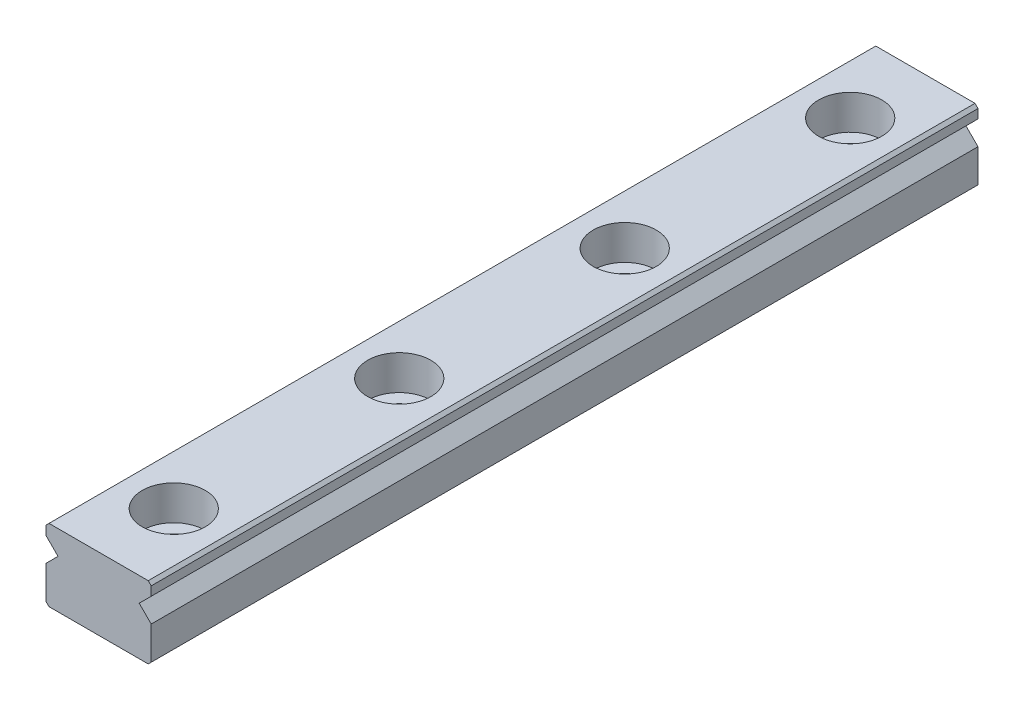
ISO-10303-21;
HEADER;
FILE_DESCRIPTION(('STEP AP214'),'2;1');
FILE_NAME('part.step','',(''),(''),'','','');
FILE_SCHEMA(('AUTOMOTIVE_DESIGN { 1 0 10303 214 1 1 1 1 }'));
ENDSEC;
DATA;
#1=APPLICATION_CONTEXT('core data for automotive mechanical design processes');
#2=APPLICATION_PROTOCOL_DEFINITION('international standard','automotive_design',2000,#1);
#3=PRODUCT_CONTEXT('',#1,'mechanical');
#4=PRODUCT('Part','Part','',(#3));
#5=PRODUCT_RELATED_PRODUCT_CATEGORY('part','',(#4));
#6=PRODUCT_DEFINITION_FORMATION('','',#4);
#7=PRODUCT_DEFINITION_CONTEXT('part definition',#1,'design');
#8=PRODUCT_DEFINITION('design','',#6,#7);
#9=PRODUCT_DEFINITION_SHAPE('','',#8);
#10=(LENGTH_UNIT() NAMED_UNIT(*) SI_UNIT(.MILLI.,.METRE.));
#11=(NAMED_UNIT(*) PLANE_ANGLE_UNIT() SI_UNIT($,.RADIAN.));
#12=(NAMED_UNIT(*) SI_UNIT($,.STERADIAN.) SOLID_ANGLE_UNIT());
#13=UNCERTAINTY_MEASURE_WITH_UNIT(LENGTH_MEASURE(1.E-05),#10,'distance_accuracy_value','');
#14=(GEOMETRIC_REPRESENTATION_CONTEXT(3) GLOBAL_UNCERTAINTY_ASSIGNED_CONTEXT((#13)) GLOBAL_UNIT_ASSIGNED_CONTEXT((#10,
#11,#12)) REPRESENTATION_CONTEXT('',''));
#15=CARTESIAN_POINT('',(0.,0.,0.));
#16=DIRECTION('',(0.,0.,1.));
#17=DIRECTION('',(1.,0.,0.));
#18=AXIS2_PLACEMENT_3D('',#15,#16,#17);
#19=CARTESIAN_POINT('',(-3.5,2.4,55.));
#20=DIRECTION('',(1.,0.,0.));
#21=DIRECTION('',(0.,0.,-1.));
#22=AXIS2_PLACEMENT_3D('',#19,#20,#21);
#23=PLANE('',#22);
#24=DIRECTION('',(0.,-1.,0.));
#25=VECTOR('',#24,1.);
#26=CARTESIAN_POINT('',(-3.5,2.4,0.));
#27=LINE('',#26,#25);
#28=CARTESIAN_POINT('',(-3.5,2.4,0.));
#29=VERTEX_POINT('',#28);
#30=CARTESIAN_POINT('',(-3.5,0.200000000000013,0.));
#31=VERTEX_POINT('',#30);
#32=EDGE_CURVE('E179',#29,#31,#27,.T.);
#33=ORIENTED_EDGE('',*,*,#32,.T.);
#34=DIRECTION('',(0.,0.,1.));
#35=VECTOR('',#34,1.);
#36=CARTESIAN_POINT('',(-3.5,0.200000000000013,55.));
#37=LINE('',#36,#35);
#38=CARTESIAN_POINT('',(-3.5,0.200000000000013,55.));
#39=VERTEX_POINT('',#38);
#40=EDGE_CURVE('E227',#31,#39,#37,.T.);
#41=ORIENTED_EDGE('',*,*,#40,.T.);
#42=DIRECTION('',(0.,-1.,0.));
#43=VECTOR('',#42,1.);
#44=CARTESIAN_POINT('',(-3.5,2.4,55.));
#45=LINE('',#44,#43);
#46=CARTESIAN_POINT('',(-3.5,2.4,55.));
#47=VERTEX_POINT('',#46);
#48=EDGE_CURVE('E202',#47,#39,#45,.T.);
#49=ORIENTED_EDGE('',*,*,#48,.F.);
#50=DIRECTION('',(0.,0.,-1.));
#51=VECTOR('',#50,1.);
#52=CARTESIAN_POINT('',(-3.5,2.4,55.));
#53=LINE('',#52,#51);
#54=EDGE_CURVE('E178',#47,#29,#53,.T.);
#55=ORIENTED_EDGE('',*,*,#54,.T.);
#56=EDGE_LOOP('',(#33,#41,#49,#55));
#57=FACE_BOUND('',#56,.T.);
#58=ADVANCED_FACE('F34',(#57),#23,.F.);
#59=CARTESIAN_POINT('',(-3.5,0.,55.));
#60=DIRECTION('',(0.,1.,0.));
#61=DIRECTION('',(-1.,0.,0.));
#62=AXIS2_PLACEMENT_3D('',#59,#60,#61);
#63=PLANE('',#62);
#64=CARTESIAN_POINT('',(0.,0.,20.));
#65=DIRECTION('',(0.,1.,0.));
#66=DIRECTION('',(-1.,0.,0.));
#67=AXIS2_PLACEMENT_3D('',#64,#65,#66);
#68=CIRCLE('',#67,1.2);
#69=CARTESIAN_POINT('',(-1.2,0.,20.));
#70=VERTEX_POINT('',#69);
#71=EDGE_CURVE('E309',#70,#70,#68,.T.);
#72=ORIENTED_EDGE('',*,*,#71,.T.);
#73=EDGE_LOOP('',(#72));
#74=FACE_BOUND('',#73,.T.);
#75=CARTESIAN_POINT('',(0.,0.,50.));
#76=DIRECTION('',(0.,1.,0.));
#77=DIRECTION('',(-1.,0.,0.));
#78=AXIS2_PLACEMENT_3D('',#75,#76,#77);
#79=CIRCLE('',#78,1.2);
#80=CARTESIAN_POINT('',(-1.2,0.,50.));
#81=VERTEX_POINT('',#80);
#82=EDGE_CURVE('E321',#81,#81,#79,.T.);
#83=ORIENTED_EDGE('',*,*,#82,.T.);
#84=EDGE_LOOP('',(#83));
#85=FACE_BOUND('',#84,.T.);
#86=CARTESIAN_POINT('',(0.,0.,35.));
#87=DIRECTION('',(0.,1.,0.));
#88=DIRECTION('',(-1.,0.,0.));
#89=AXIS2_PLACEMENT_3D('',#86,#87,#88);
#90=CIRCLE('',#89,1.2);
#91=CARTESIAN_POINT('',(-1.2,0.,35.));
#92=VERTEX_POINT('',#91);
#93=EDGE_CURVE('E315',#92,#92,#90,.T.);
#94=ORIENTED_EDGE('',*,*,#93,.T.);
#95=EDGE_LOOP('',(#94));
#96=FACE_BOUND('',#95,.T.);
#97=CARTESIAN_POINT('',(0.,0.,5.));
#98=DIRECTION('',(0.,1.,0.));
#99=DIRECTION('',(-1.,0.,0.));
#100=AXIS2_PLACEMENT_3D('',#97,#98,#99);
#101=CIRCLE('',#100,1.2);
#102=CARTESIAN_POINT('',(-1.2,0.,5.));
#103=VERTEX_POINT('',#102);
#104=EDGE_CURVE('E292',#103,#103,#101,.T.);
#105=ORIENTED_EDGE('',*,*,#104,.T.);
#106=EDGE_LOOP('',(#105));
#107=FACE_BOUND('',#106,.T.);
#108=DIRECTION('',(1.,0.,0.));
#109=VECTOR('',#108,1.);
#110=CARTESIAN_POINT('',(-3.5,0.,55.));
#111=LINE('',#110,#109);
#112=CARTESIAN_POINT('',(-3.29999999999999,0.,55.));
#113=VERTEX_POINT('',#112);
#114=CARTESIAN_POINT('',(3.3,0.,55.));
#115=VERTEX_POINT('',#114);
#116=EDGE_CURVE('E147',#113,#115,#111,.T.);
#117=ORIENTED_EDGE('',*,*,#116,.F.);
#118=DIRECTION('',(0.,0.,-1.));
#119=VECTOR('',#118,1.);
#120=CARTESIAN_POINT('',(-3.29999999999999,0.,55.));
#121=LINE('',#120,#119);
#122=CARTESIAN_POINT('',(-3.29999999999999,0.,0.));
#123=VERTEX_POINT('',#122);
#124=EDGE_CURVE('E216',#113,#123,#121,.T.);
#125=ORIENTED_EDGE('',*,*,#124,.T.);
#126=DIRECTION('',(1.,0.,0.));
#127=VECTOR('',#126,1.);
#128=CARTESIAN_POINT('',(-3.5,0.,0.));
#129=LINE('',#128,#127);
#130=CARTESIAN_POINT('',(3.3,0.,0.));
#131=VERTEX_POINT('',#130);
#132=EDGE_CURVE('E182',#123,#131,#129,.T.);
#133=ORIENTED_EDGE('',*,*,#132,.T.);
#134=DIRECTION('',(0.,0.,1.));
#135=VECTOR('',#134,1.);
#136=CARTESIAN_POINT('',(3.3,0.,55.));
#137=LINE('',#136,#135);
#138=EDGE_CURVE('E156',#131,#115,#137,.T.);
#139=ORIENTED_EDGE('',*,*,#138,.T.);
#140=EDGE_LOOP('',(#117,#125,#133,#139));
#141=FACE_BOUND('',#140,.T.);
#142=ADVANCED_FACE('F330',(#74,#85,#96,#107,#141),#63,.F.);
#143=CARTESIAN_POINT('',(3.5,0.,55.));
#144=DIRECTION('',(-1.,0.,0.));
#145=DIRECTION('',(0.,0.,1.));
#146=AXIS2_PLACEMENT_3D('',#143,#144,#145);
#147=PLANE('',#146);
#148=DIRECTION('',(0.,1.,0.));
#149=VECTOR('',#148,1.);
#150=CARTESIAN_POINT('',(3.5,0.,55.));
#151=LINE('',#150,#149);
#152=CARTESIAN_POINT('',(3.5,0.2,55.));
#153=VERTEX_POINT('',#152);
#154=CARTESIAN_POINT('',(3.5,2.4,55.));
#155=VERTEX_POINT('',#154);
#156=EDGE_CURVE('E134',#153,#155,#151,.T.);
#157=ORIENTED_EDGE('',*,*,#156,.F.);
#158=DIRECTION('',(0.,0.,-1.));
#159=VECTOR('',#158,1.);
#160=CARTESIAN_POINT('',(3.5,0.2,55.));
#161=LINE('',#160,#159);
#162=CARTESIAN_POINT('',(3.5,0.2,0.));
#163=VERTEX_POINT('',#162);
#164=EDGE_CURVE('E42',#153,#163,#161,.T.);
#165=ORIENTED_EDGE('',*,*,#164,.T.);
#166=DIRECTION('',(0.,1.,0.));
#167=VECTOR('',#166,1.);
#168=CARTESIAN_POINT('',(3.5,0.,0.));
#169=LINE('',#168,#167);
#170=CARTESIAN_POINT('',(3.5,2.4,0.));
#171=VERTEX_POINT('',#170);
#172=EDGE_CURVE('E153',#163,#171,#169,.T.);
#173=ORIENTED_EDGE('',*,*,#172,.T.);
#174=DIRECTION('',(0.,0.,-1.));
#175=VECTOR('',#174,1.);
#176=CARTESIAN_POINT('',(3.5,2.4,55.));
#177=LINE('',#176,#175);
#178=EDGE_CURVE('E150',#155,#171,#177,.T.);
#179=ORIENTED_EDGE('',*,*,#178,.F.);
#180=EDGE_LOOP('',(#157,#165,#173,#179));
#181=FACE_BOUND('',#180,.T.);
#182=ADVANCED_FACE('F151',(#181),#147,.F.);
#183=CARTESIAN_POINT('',(3.5,2.4,55.));
#184=DIRECTION('',(-0.707106781186547,-0.707106781186548,0.));
#185=DIRECTION('',(0.707106781186548,-0.707106781186547,0.));
#186=AXIS2_PLACEMENT_3D('',#183,#184,#185);
#187=PLANE('',#186);
#188=DIRECTION('',(-0.707106781186548,0.707106781186547,0.));
#189=VECTOR('',#188,1.);
#190=CARTESIAN_POINT('',(3.5,2.4,0.));
#191=LINE('',#190,#189);
#192=CARTESIAN_POINT('',(2.7,3.2,0.));
#193=VERTEX_POINT('',#192);
#194=EDGE_CURVE('E187',#171,#193,#191,.T.);
#195=ORIENTED_EDGE('',*,*,#194,.T.);
#196=DIRECTION('',(0.,0.,-1.));
#197=VECTOR('',#196,1.);
#198=CARTESIAN_POINT('',(2.7,3.2,55.));
#199=LINE('',#198,#197);
#200=CARTESIAN_POINT('',(2.7,3.2,55.));
#201=VERTEX_POINT('',#200);
#202=EDGE_CURVE('E157',#201,#193,#199,.T.);
#203=ORIENTED_EDGE('',*,*,#202,.F.);
#204=DIRECTION('',(-0.707106781186548,0.707106781186547,0.));
#205=VECTOR('',#204,1.);
#206=CARTESIAN_POINT('',(3.5,2.4,55.));
#207=LINE('',#206,#205);
#208=EDGE_CURVE('E139',#155,#201,#207,.T.);
#209=ORIENTED_EDGE('',*,*,#208,.F.);
#210=ORIENTED_EDGE('',*,*,#178,.T.);
#211=EDGE_LOOP('',(#195,#203,#209,#210));
#212=FACE_BOUND('',#211,.T.);
#213=ADVANCED_FACE('F159',(#212),#187,.F.);
#214=CARTESIAN_POINT('',(2.7,3.2,55.));
#215=DIRECTION('',(-0.707106781186547,0.707106781186548,0.));
#216=DIRECTION('',(-0.707106781186548,-0.707106781186547,0.));
#217=AXIS2_PLACEMENT_3D('',#214,#215,#216);
#218=PLANE('',#217);
#219=DIRECTION('',(0.707106781186548,0.707106781186547,0.));
#220=VECTOR('',#219,1.);
#221=CARTESIAN_POINT('',(2.7,3.2,0.));
#222=LINE('',#221,#220);
#223=CARTESIAN_POINT('',(3.5,4.,0.));
#224=VERTEX_POINT('',#223);
#225=EDGE_CURVE('E189',#193,#224,#222,.T.);
#226=ORIENTED_EDGE('',*,*,#225,.T.);
#227=DIRECTION('',(0.,0.,-1.));
#228=VECTOR('',#227,1.);
#229=CARTESIAN_POINT('',(3.5,4.,55.));
#230=LINE('',#229,#228);
#231=CARTESIAN_POINT('',(3.5,4.,55.));
#232=VERTEX_POINT('',#231);
#233=EDGE_CURVE('E211',#232,#224,#230,.T.);
#234=ORIENTED_EDGE('',*,*,#233,.F.);
#235=DIRECTION('',(0.707106781186548,0.707106781186547,0.));
#236=VECTOR('',#235,1.);
#237=CARTESIAN_POINT('',(2.7,3.2,55.));
#238=LINE('',#237,#236);
#239=EDGE_CURVE('E162',#201,#232,#238,.T.);
#240=ORIENTED_EDGE('',*,*,#239,.F.);
#241=ORIENTED_EDGE('',*,*,#202,.T.);
#242=EDGE_LOOP('',(#226,#234,#240,#241));
#243=FACE_BOUND('',#242,.T.);
#244=ADVANCED_FACE('F248',(#243),#218,.F.);
#245=CARTESIAN_POINT('',(3.5,4.,55.));
#246=DIRECTION('',(-1.,0.,0.));
#247=DIRECTION('',(0.,0.,1.));
#248=AXIS2_PLACEMENT_3D('',#245,#246,#247);
#249=PLANE('',#248);
#250=DIRECTION('',(0.,1.,0.));
#251=VECTOR('',#250,1.);
#252=CARTESIAN_POINT('',(3.5,4.,0.));
#253=LINE('',#252,#251);
#254=CARTESIAN_POINT('',(3.5,4.59999999999999,0.));
#255=VERTEX_POINT('',#254);
#256=EDGE_CURVE('E191',#224,#255,#253,.T.);
#257=ORIENTED_EDGE('',*,*,#256,.T.);
#258=DIRECTION('',(0.,0.,1.));
#259=VECTOR('',#258,1.);
#260=CARTESIAN_POINT('',(3.5,4.59999999999999,55.));
#261=LINE('',#260,#259);
#262=CARTESIAN_POINT('',(3.5,4.59999999999999,55.));
#263=VERTEX_POINT('',#262);
#264=EDGE_CURVE('E11',#255,#263,#261,.T.);
#265=ORIENTED_EDGE('',*,*,#264,.T.);
#266=DIRECTION('',(0.,1.,0.));
#267=VECTOR('',#266,1.);
#268=CARTESIAN_POINT('',(3.5,4.,55.));
#269=LINE('',#268,#267);
#270=EDGE_CURVE('E164',#232,#263,#269,.T.);
#271=ORIENTED_EDGE('',*,*,#270,.F.);
#272=ORIENTED_EDGE('',*,*,#233,.T.);
#273=EDGE_LOOP('',(#257,#265,#271,#272));
#274=FACE_BOUND('',#273,.T.);
#275=ADVANCED_FACE('F357',(#274),#249,.F.);
#276=CARTESIAN_POINT('',(3.5,4.8,55.));
#277=DIRECTION('',(0.,-1.,0.));
#278=DIRECTION('',(1.,0.,0.));
#279=AXIS2_PLACEMENT_3D('',#276,#277,#278);
#280=PLANE('',#279);
#281=CARTESIAN_POINT('',(0.,4.8,20.));
#282=DIRECTION('',(0.,1.,0.));
#283=DIRECTION('',(-1.,0.,0.));
#284=AXIS2_PLACEMENT_3D('',#281,#282,#283);
#285=CIRCLE('',#284,2.1);
#286=CARTESIAN_POINT('',(-2.1,4.8,20.));
#287=VERTEX_POINT('',#286);
#288=EDGE_CURVE('E301',#287,#287,#285,.T.);
#289=ORIENTED_EDGE('',*,*,#288,.F.);
#290=EDGE_LOOP('',(#289));
#291=FACE_BOUND('',#290,.T.);
#292=CARTESIAN_POINT('',(0.,4.8,35.));
#293=DIRECTION('',(0.,1.,0.));
#294=DIRECTION('',(-1.,0.,0.));
#295=AXIS2_PLACEMENT_3D('',#292,#293,#294);
#296=CIRCLE('',#295,2.1);
#297=CARTESIAN_POINT('',(-2.1,4.8,35.));
#298=VERTEX_POINT('',#297);
#299=EDGE_CURVE('E295',#298,#298,#296,.T.);
#300=ORIENTED_EDGE('',*,*,#299,.F.);
#301=EDGE_LOOP('',(#300));
#302=FACE_BOUND('',#301,.T.);
#303=CARTESIAN_POINT('',(0.,4.8,50.));
#304=DIRECTION('',(0.,1.,0.));
#305=DIRECTION('',(-1.,0.,0.));
#306=AXIS2_PLACEMENT_3D('',#303,#304,#305);
#307=CIRCLE('',#306,2.1);
#308=CARTESIAN_POINT('',(-2.1,4.8,50.));
#309=VERTEX_POINT('',#308);
#310=EDGE_CURVE('E288',#309,#309,#307,.T.);
#311=ORIENTED_EDGE('',*,*,#310,.F.);
#312=EDGE_LOOP('',(#311));
#313=FACE_BOUND('',#312,.T.);
#314=CARTESIAN_POINT('',(0.,4.8,5.));
#315=DIRECTION('',(0.,1.,0.));
#316=DIRECTION('',(-1.,0.,0.));
#317=AXIS2_PLACEMENT_3D('',#314,#315,#316);
#318=CIRCLE('',#317,2.1);
#319=CARTESIAN_POINT('',(-2.1,4.8,5.));
#320=VERTEX_POINT('',#319);
#321=EDGE_CURVE('E282',#320,#320,#318,.T.);
#322=ORIENTED_EDGE('',*,*,#321,.F.);
#323=EDGE_LOOP('',(#322));
#324=FACE_BOUND('',#323,.T.);
#325=DIRECTION('',(-1.,0.,0.));
#326=VECTOR('',#325,1.);
#327=CARTESIAN_POINT('',(3.5,4.8,0.));
#328=LINE('',#327,#326);
#329=CARTESIAN_POINT('',(3.29999999999999,4.8,0.));
#330=VERTEX_POINT('',#329);
#331=CARTESIAN_POINT('',(-3.29999999999999,4.8,0.));
#332=VERTEX_POINT('',#331);
#333=EDGE_CURVE('E194',#330,#332,#328,.T.);
#334=ORIENTED_EDGE('',*,*,#333,.T.);
#335=DIRECTION('',(0.,0.,1.));
#336=VECTOR('',#335,1.);
#337=CARTESIAN_POINT('',(-3.29999999999999,4.8,55.));
#338=LINE('',#337,#336);
#339=CARTESIAN_POINT('',(-3.29999999999999,4.8,55.));
#340=VERTEX_POINT('',#339);
#341=EDGE_CURVE('E57',#332,#340,#338,.T.);
#342=ORIENTED_EDGE('',*,*,#341,.T.);
#343=DIRECTION('',(-1.,0.,0.));
#344=VECTOR('',#343,1.);
#345=CARTESIAN_POINT('',(3.5,4.8,55.));
#346=LINE('',#345,#344);
#347=CARTESIAN_POINT('',(3.29999999999999,4.8,55.));
#348=VERTEX_POINT('',#347);
#349=EDGE_CURVE('E170',#348,#340,#346,.T.);
#350=ORIENTED_EDGE('',*,*,#349,.F.);
#351=DIRECTION('',(0.,0.,-1.));
#352=VECTOR('',#351,1.);
#353=CARTESIAN_POINT('',(3.29999999999999,4.8,55.));
#354=LINE('',#353,#352);
#355=EDGE_CURVE('E238',#348,#330,#354,.T.);
#356=ORIENTED_EDGE('',*,*,#355,.T.);
#357=EDGE_LOOP('',(#334,#342,#350,#356));
#358=FACE_BOUND('',#357,.T.);
#359=ADVANCED_FACE('F257',(#291,#302,#313,#324,#358),#280,.F.);
#360=CARTESIAN_POINT('',(-3.5,4.8,55.));
#361=DIRECTION('',(1.,0.,0.));
#362=DIRECTION('',(0.,0.,-1.));
#363=AXIS2_PLACEMENT_3D('',#360,#361,#362);
#364=PLANE('',#363);
#365=DIRECTION('',(0.,-1.,0.));
#366=VECTOR('',#365,1.);
#367=CARTESIAN_POINT('',(-3.5,4.8,55.));
#368=LINE('',#367,#366);
#369=CARTESIAN_POINT('',(-3.5,4.59999999999999,55.));
#370=VERTEX_POINT('',#369);
#371=CARTESIAN_POINT('',(-3.5,4.,55.));
#372=VERTEX_POINT('',#371);
#373=EDGE_CURVE('E172',#370,#372,#368,.T.);
#374=ORIENTED_EDGE('',*,*,#373,.F.);
#375=DIRECTION('',(0.,0.,-1.));
#376=VECTOR('',#375,1.);
#377=CARTESIAN_POINT('',(-3.5,4.59999999999999,55.));
#378=LINE('',#377,#376);
#379=CARTESIAN_POINT('',(-3.5,4.59999999999999,0.));
#380=VERTEX_POINT('',#379);
#381=EDGE_CURVE('E235',#370,#380,#378,.T.);
#382=ORIENTED_EDGE('',*,*,#381,.T.);
#383=DIRECTION('',(0.,-1.,0.));
#384=VECTOR('',#383,1.);
#385=CARTESIAN_POINT('',(-3.5,4.8,0.));
#386=LINE('',#385,#384);
#387=CARTESIAN_POINT('',(-3.5,4.,0.));
#388=VERTEX_POINT('',#387);
#389=EDGE_CURVE('E196',#380,#388,#386,.T.);
#390=ORIENTED_EDGE('',*,*,#389,.T.);
#391=DIRECTION('',(0.,0.,-1.));
#392=VECTOR('',#391,1.);
#393=CARTESIAN_POINT('',(-3.5,4.,55.));
#394=LINE('',#393,#392);
#395=EDGE_CURVE('E208',#372,#388,#394,.T.);
#396=ORIENTED_EDGE('',*,*,#395,.F.);
#397=EDGE_LOOP('',(#374,#382,#390,#396));
#398=FACE_BOUND('',#397,.T.);
#399=ADVANCED_FACE('F264',(#398),#364,.F.);
#400=CARTESIAN_POINT('',(-3.5,4.,55.));
#401=DIRECTION('',(0.707106781186547,0.707106781186548,0.));
#402=DIRECTION('',(-0.707106781186548,0.707106781186547,0.));
#403=AXIS2_PLACEMENT_3D('',#400,#401,#402);
#404=PLANE('',#403);
#405=DIRECTION('',(0.707106781186548,-0.707106781186547,0.));
#406=VECTOR('',#405,1.);
#407=CARTESIAN_POINT('',(-3.5,4.,0.));
#408=LINE('',#407,#406);
#409=CARTESIAN_POINT('',(-2.7,3.2,0.));
#410=VERTEX_POINT('',#409);
#411=EDGE_CURVE('E198',#388,#410,#408,.T.);
#412=ORIENTED_EDGE('',*,*,#411,.T.);
#413=DIRECTION('',(0.,0.,-1.));
#414=VECTOR('',#413,1.);
#415=CARTESIAN_POINT('',(-2.7,3.2,55.));
#416=LINE('',#415,#414);
#417=CARTESIAN_POINT('',(-2.7,3.2,55.));
#418=VERTEX_POINT('',#417);
#419=EDGE_CURVE('E205',#418,#410,#416,.T.);
#420=ORIENTED_EDGE('',*,*,#419,.F.);
#421=DIRECTION('',(0.707106781186548,-0.707106781186547,0.));
#422=VECTOR('',#421,1.);
#423=CARTESIAN_POINT('',(-3.5,4.,55.));
#424=LINE('',#423,#422);
#425=EDGE_CURVE('E174',#372,#418,#424,.T.);
#426=ORIENTED_EDGE('',*,*,#425,.F.);
#427=ORIENTED_EDGE('',*,*,#395,.T.);
#428=EDGE_LOOP('',(#412,#420,#426,#427));
#429=FACE_BOUND('',#428,.T.);
#430=ADVANCED_FACE('F271',(#429),#404,.F.);
#431=CARTESIAN_POINT('',(-2.7,3.2,55.));
#432=DIRECTION('',(0.707106781186548,-0.707106781186547,0.));
#433=DIRECTION('',(0.707106781186547,0.707106781186548,0.));
#434=AXIS2_PLACEMENT_3D('',#431,#432,#433);
#435=PLANE('',#434);
#436=DIRECTION('',(-0.707106781186547,-0.707106781186548,0.));
#437=VECTOR('',#436,1.);
#438=CARTESIAN_POINT('',(-2.7,3.2,0.));
#439=LINE('',#438,#437);
#440=EDGE_CURVE('E200',#410,#29,#439,.T.);
#441=ORIENTED_EDGE('',*,*,#440,.T.);
#442=ORIENTED_EDGE('',*,*,#54,.F.);
#443=DIRECTION('',(-0.707106781186547,-0.707106781186548,0.));
#444=VECTOR('',#443,1.);
#445=CARTESIAN_POINT('',(-2.7,3.2,55.));
#446=LINE('',#445,#444);
#447=EDGE_CURVE('E176',#418,#47,#446,.T.);
#448=ORIENTED_EDGE('',*,*,#447,.F.);
#449=ORIENTED_EDGE('',*,*,#419,.T.);
#450=EDGE_LOOP('',(#441,#442,#448,#449));
#451=FACE_BOUND('',#450,.T.);
#452=ADVANCED_FACE('F274',(#451),#435,.F.);
#453=CARTESIAN_POINT('',(0.,0.,55.));
#454=DIRECTION('',(0.,0.,1.));
#455=DIRECTION('',(1.,0.,0.));
#456=AXIS2_PLACEMENT_3D('',#453,#454,#455);
#457=PLANE('',#456);
#458=ORIENTED_EDGE('',*,*,#48,.T.);
#459=DIRECTION('',(-0.707106781186535,0.70710678118656,0.));
#460=VECTOR('',#459,1.);
#461=CARTESIAN_POINT('',(-1.65000000000005,-1.65,55.));
#462=LINE('',#461,#460);
#463=EDGE_CURVE('E233',#39,#113,#462,.F.);
#464=ORIENTED_EDGE('',*,*,#463,.T.);
#465=ORIENTED_EDGE('',*,*,#116,.T.);
#466=DIRECTION('',(-0.707106781186548,-0.707106781186548,0.));
#467=VECTOR('',#466,1.);
#468=CARTESIAN_POINT('',(1.65,-1.65,55.));
#469=LINE('',#468,#467);
#470=EDGE_CURVE('E143',#115,#153,#469,.F.);
#471=ORIENTED_EDGE('',*,*,#470,.T.);
#472=ORIENTED_EDGE('',*,*,#156,.T.);
#473=ORIENTED_EDGE('',*,*,#208,.T.);
#474=ORIENTED_EDGE('',*,*,#239,.T.);
#475=ORIENTED_EDGE('',*,*,#270,.T.);
#476=DIRECTION('',(0.707106781186535,-0.70710678118656,0.));
#477=VECTOR('',#476,1.);
#478=CARTESIAN_POINT('',(4.05000000000005,4.04999999999991,55.));
#479=LINE('',#478,#477);
#480=EDGE_CURVE('E229',#263,#348,#479,.F.);
#481=ORIENTED_EDGE('',*,*,#480,.T.);
#482=ORIENTED_EDGE('',*,*,#349,.T.);
#483=DIRECTION('',(0.707106781186548,0.707106781186548,0.));
#484=VECTOR('',#483,1.);
#485=CARTESIAN_POINT('',(-4.04999999999999,4.04999999999999,55.));
#486=LINE('',#485,#484);
#487=EDGE_CURVE('E49',#340,#370,#486,.F.);
#488=ORIENTED_EDGE('',*,*,#487,.T.);
#489=ORIENTED_EDGE('',*,*,#373,.T.);
#490=ORIENTED_EDGE('',*,*,#425,.T.);
#491=ORIENTED_EDGE('',*,*,#447,.T.);
#492=EDGE_LOOP('',(#458,#464,#465,#471,#472,#473,#474,#475,#481,#482,#488,#489,#490,#491));
#493=FACE_BOUND('',#492,.T.);
#494=ADVANCED_FACE('F137',(#493),#457,.T.);
#495=CARTESIAN_POINT('',(0.,0.,0.));
#496=DIRECTION('',(0.,0.,1.));
#497=DIRECTION('',(1.,0.,0.));
#498=AXIS2_PLACEMENT_3D('',#495,#496,#497);
#499=PLANE('',#498);
#500=ORIENTED_EDGE('',*,*,#132,.F.);
#501=DIRECTION('',(0.707106781186535,-0.70710678118656,0.));
#502=VECTOR('',#501,1.);
#503=CARTESIAN_POINT('',(-3.29999999999999,0.,0.));
#504=LINE('',#503,#502);
#505=EDGE_CURVE('E225',#123,#31,#504,.F.);
#506=ORIENTED_EDGE('',*,*,#505,.T.);
#507=ORIENTED_EDGE('',*,*,#32,.F.);
#508=ORIENTED_EDGE('',*,*,#440,.F.);
#509=ORIENTED_EDGE('',*,*,#411,.F.);
#510=ORIENTED_EDGE('',*,*,#389,.F.);
#511=DIRECTION('',(-0.707106781186548,-0.707106781186548,0.));
#512=VECTOR('',#511,1.);
#513=CARTESIAN_POINT('',(-3.5,4.59999999999999,0.));
#514=LINE('',#513,#512);
#515=EDGE_CURVE('E223',#380,#332,#514,.F.);
#516=ORIENTED_EDGE('',*,*,#515,.T.);
#517=ORIENTED_EDGE('',*,*,#333,.F.);
#518=DIRECTION('',(-0.707106781186535,0.70710678118656,0.));
#519=VECTOR('',#518,1.);
#520=CARTESIAN_POINT('',(3.29999999999999,4.8,0.));
#521=LINE('',#520,#519);
#522=EDGE_CURVE('E219',#330,#255,#521,.F.);
#523=ORIENTED_EDGE('',*,*,#522,.T.);
#524=ORIENTED_EDGE('',*,*,#256,.F.);
#525=ORIENTED_EDGE('',*,*,#225,.F.);
#526=ORIENTED_EDGE('',*,*,#194,.F.);
#527=ORIENTED_EDGE('',*,*,#172,.F.);
#528=DIRECTION('',(0.707106781186548,0.707106781186548,0.));
#529=VECTOR('',#528,1.);
#530=CARTESIAN_POINT('',(3.5,0.2,0.));
#531=LINE('',#530,#529);
#532=EDGE_CURVE('E221',#163,#131,#531,.F.);
#533=ORIENTED_EDGE('',*,*,#532,.T.);
#534=EDGE_LOOP('',(#500,#506,#507,#508,#509,#510,#516,#517,#523,#524,#525,#526,#527,#533));
#535=FACE_BOUND('',#534,.T.);
#536=ADVANCED_FACE('F244',(#535),#499,.F.);
#537=CARTESIAN_POINT('',(0.,2.5,5.));
#538=DIRECTION('',(0.,1.,0.));
#539=DIRECTION('',(-1.,0.,0.));
#540=AXIS2_PLACEMENT_3D('',#537,#538,#539);
#541=CYLINDRICAL_SURFACE('',#540,2.1);
#542=CARTESIAN_POINT('',(0.,2.5,5.));
#543=DIRECTION('',(0.,1.,0.));
#544=DIRECTION('',(-1.,0.,0.));
#545=AXIS2_PLACEMENT_3D('',#542,#543,#544);
#546=CIRCLE('',#545,2.1);
#547=CARTESIAN_POINT('',(-2.1,2.5,5.));
#548=VERTEX_POINT('',#547);
#549=EDGE_CURVE('E183',#548,#548,#546,.T.);
#550=ORIENTED_EDGE('',*,*,#549,.F.);
#551=EDGE_LOOP('',(#550));
#552=FACE_BOUND('',#551,.T.);
#553=ORIENTED_EDGE('',*,*,#321,.T.);
#554=EDGE_LOOP('',(#553));
#555=FACE_BOUND('',#554,.T.);
#556=ADVANCED_FACE('F365',(#552,#555),#541,.F.);
#557=CARTESIAN_POINT('',(0.,2.5,5.));
#558=DIRECTION('',(0.,1.,0.));
#559=DIRECTION('',(-1.,0.,0.));
#560=AXIS2_PLACEMENT_3D('',#557,#558,#559);
#561=PLANE('',#560);
#562=CARTESIAN_POINT('',(0.,2.5,5.));
#563=DIRECTION('',(0.,1.,0.));
#564=DIRECTION('',(-1.,0.,0.));
#565=AXIS2_PLACEMENT_3D('',#562,#563,#564);
#566=CIRCLE('',#565,1.2);
#567=CARTESIAN_POINT('',(-1.2,2.5,5.));
#568=VERTEX_POINT('',#567);
#569=EDGE_CURVE('E306',#568,#568,#566,.T.);
#570=ORIENTED_EDGE('',*,*,#569,.F.);
#571=EDGE_LOOP('',(#570));
#572=FACE_BOUND('',#571,.T.);
#573=ORIENTED_EDGE('',*,*,#549,.T.);
#574=EDGE_LOOP('',(#573));
#575=FACE_BOUND('',#574,.T.);
#576=ADVANCED_FACE('F367',(#572,#575),#561,.T.);
#577=CARTESIAN_POINT('',(0.,2.5,50.));
#578=DIRECTION('',(0.,1.,0.));
#579=DIRECTION('',(-1.,0.,0.));
#580=AXIS2_PLACEMENT_3D('',#577,#578,#579);
#581=CYLINDRICAL_SURFACE('',#580,2.1);
#582=CARTESIAN_POINT('',(0.,2.5,50.));
#583=DIRECTION('',(0.,1.,0.));
#584=DIRECTION('',(-1.,0.,0.));
#585=AXIS2_PLACEMENT_3D('',#582,#583,#584);
#586=CIRCLE('',#585,2.1);
#587=CARTESIAN_POINT('',(-2.1,2.5,50.));
#588=VERTEX_POINT('',#587);
#589=EDGE_CURVE('E291',#588,#588,#586,.T.);
#590=ORIENTED_EDGE('',*,*,#589,.F.);
#591=EDGE_LOOP('',(#590));
#592=FACE_BOUND('',#591,.T.);
#593=ORIENTED_EDGE('',*,*,#310,.T.);
#594=EDGE_LOOP('',(#593));
#595=FACE_BOUND('',#594,.T.);
#596=ADVANCED_FACE('F374',(#592,#595),#581,.F.);
#597=CARTESIAN_POINT('',(0.,2.5,50.));
#598=DIRECTION('',(0.,1.,0.));
#599=DIRECTION('',(-1.,0.,0.));
#600=AXIS2_PLACEMENT_3D('',#597,#598,#599);
#601=PLANE('',#600);
#602=CARTESIAN_POINT('',(0.,2.5,50.));
#603=DIRECTION('',(0.,1.,0.));
#604=DIRECTION('',(-1.,0.,0.));
#605=AXIS2_PLACEMENT_3D('',#602,#603,#604);
#606=CIRCLE('',#605,1.2);
#607=CARTESIAN_POINT('',(-1.2,2.5,50.));
#608=VERTEX_POINT('',#607);
#609=EDGE_CURVE('E318',#608,#608,#606,.T.);
#610=ORIENTED_EDGE('',*,*,#609,.F.);
#611=EDGE_LOOP('',(#610));
#612=FACE_BOUND('',#611,.T.);
#613=ORIENTED_EDGE('',*,*,#589,.T.);
#614=EDGE_LOOP('',(#613));
#615=FACE_BOUND('',#614,.T.);
#616=ADVANCED_FACE('F419',(#612,#615),#601,.T.);
#617=CARTESIAN_POINT('',(0.,2.5,35.));
#618=DIRECTION('',(0.,1.,0.));
#619=DIRECTION('',(-1.,0.,0.));
#620=AXIS2_PLACEMENT_3D('',#617,#618,#619);
#621=CYLINDRICAL_SURFACE('',#620,2.1);
#622=CARTESIAN_POINT('',(0.,2.5,35.));
#623=DIRECTION('',(0.,1.,0.));
#624=DIRECTION('',(-1.,0.,0.));
#625=AXIS2_PLACEMENT_3D('',#622,#623,#624);
#626=CIRCLE('',#625,2.1);
#627=CARTESIAN_POINT('',(-2.1,2.5,35.));
#628=VERTEX_POINT('',#627);
#629=EDGE_CURVE('E298',#628,#628,#626,.T.);
#630=ORIENTED_EDGE('',*,*,#629,.F.);
#631=EDGE_LOOP('',(#630));
#632=FACE_BOUND('',#631,.T.);
#633=ORIENTED_EDGE('',*,*,#299,.T.);
#634=EDGE_LOOP('',(#633));
#635=FACE_BOUND('',#634,.T.);
#636=ADVANCED_FACE('F415',(#632,#635),#621,.F.);
#637=CARTESIAN_POINT('',(0.,2.5,35.));
#638=DIRECTION('',(0.,1.,0.));
#639=DIRECTION('',(-1.,0.,0.));
#640=AXIS2_PLACEMENT_3D('',#637,#638,#639);
#641=PLANE('',#640);
#642=CARTESIAN_POINT('',(0.,2.5,35.));
#643=DIRECTION('',(0.,1.,0.));
#644=DIRECTION('',(-1.,0.,0.));
#645=AXIS2_PLACEMENT_3D('',#642,#643,#644);
#646=CIRCLE('',#645,1.2);
#647=CARTESIAN_POINT('',(-1.2,2.5,35.));
#648=VERTEX_POINT('',#647);
#649=EDGE_CURVE('E312',#648,#648,#646,.T.);
#650=ORIENTED_EDGE('',*,*,#649,.F.);
#651=EDGE_LOOP('',(#650));
#652=FACE_BOUND('',#651,.T.);
#653=ORIENTED_EDGE('',*,*,#629,.T.);
#654=EDGE_LOOP('',(#653));
#655=FACE_BOUND('',#654,.T.);
#656=ADVANCED_FACE('F351',(#652,#655),#641,.T.);
#657=CARTESIAN_POINT('',(0.,2.5,20.));
#658=DIRECTION('',(0.,1.,0.));
#659=DIRECTION('',(-1.,0.,0.));
#660=AXIS2_PLACEMENT_3D('',#657,#658,#659);
#661=CYLINDRICAL_SURFACE('',#660,2.1);
#662=CARTESIAN_POINT('',(0.,2.5,20.));
#663=DIRECTION('',(0.,1.,0.));
#664=DIRECTION('',(-1.,0.,0.));
#665=AXIS2_PLACEMENT_3D('',#662,#663,#664);
#666=CIRCLE('',#665,2.1);
#667=CARTESIAN_POINT('',(-2.1,2.5,20.));
#668=VERTEX_POINT('',#667);
#669=EDGE_CURVE('E285',#668,#668,#666,.T.);
#670=ORIENTED_EDGE('',*,*,#669,.F.);
#671=EDGE_LOOP('',(#670));
#672=FACE_BOUND('',#671,.T.);
#673=ORIENTED_EDGE('',*,*,#288,.T.);
#674=EDGE_LOOP('',(#673));
#675=FACE_BOUND('',#674,.T.);
#676=ADVANCED_FACE('F345',(#672,#675),#661,.F.);
#677=CARTESIAN_POINT('',(0.,2.5,20.));
#678=DIRECTION('',(0.,1.,0.));
#679=DIRECTION('',(-1.,0.,0.));
#680=AXIS2_PLACEMENT_3D('',#677,#678,#679);
#681=PLANE('',#680);
#682=CARTESIAN_POINT('',(0.,2.5,20.));
#683=DIRECTION('',(0.,1.,0.));
#684=DIRECTION('',(-1.,0.,0.));
#685=AXIS2_PLACEMENT_3D('',#682,#683,#684);
#686=CIRCLE('',#685,1.2);
#687=CARTESIAN_POINT('',(-1.2,2.5,20.));
#688=VERTEX_POINT('',#687);
#689=EDGE_CURVE('E324',#688,#688,#686,.T.);
#690=ORIENTED_EDGE('',*,*,#689,.F.);
#691=EDGE_LOOP('',(#690));
#692=FACE_BOUND('',#691,.T.);
#693=ORIENTED_EDGE('',*,*,#669,.T.);
#694=EDGE_LOOP('',(#693));
#695=FACE_BOUND('',#694,.T.);
#696=ADVANCED_FACE('F341',(#692,#695),#681,.T.);
#697=CARTESIAN_POINT('',(-3.29999999999999,0.,55.));
#698=DIRECTION('',(0.70710678118656,0.707106781186535,0.));
#699=DIRECTION('',(0.,0.,-1.));
#700=AXIS2_PLACEMENT_3D('',#697,#698,#699);
#701=PLANE('',#700);
#702=ORIENTED_EDGE('',*,*,#463,.F.);
#703=ORIENTED_EDGE('',*,*,#40,.F.);
#704=ORIENTED_EDGE('',*,*,#505,.F.);
#705=ORIENTED_EDGE('',*,*,#124,.F.);
#706=EDGE_LOOP('',(#702,#703,#704,#705));
#707=FACE_BOUND('',#706,.T.);
#708=ADVANCED_FACE('F344',(#707),#701,.F.);
#709=CARTESIAN_POINT('',(-3.5,4.59999999999999,55.));
#710=DIRECTION('',(0.707106781186547,-0.707106781186547,0.));
#711=DIRECTION('',(0.,0.,-1.));
#712=AXIS2_PLACEMENT_3D('',#709,#710,#711);
#713=PLANE('',#712);
#714=ORIENTED_EDGE('',*,*,#487,.F.);
#715=ORIENTED_EDGE('',*,*,#341,.F.);
#716=ORIENTED_EDGE('',*,*,#515,.F.);
#717=ORIENTED_EDGE('',*,*,#381,.F.);
#718=EDGE_LOOP('',(#714,#715,#716,#717));
#719=FACE_BOUND('',#718,.T.);
#720=ADVANCED_FACE('F262',(#719),#713,.F.);
#721=CARTESIAN_POINT('',(3.5,0.2,55.));
#722=DIRECTION('',(-0.707106781186548,0.707106781186548,0.));
#723=DIRECTION('',(0.,0.,-1.));
#724=AXIS2_PLACEMENT_3D('',#721,#722,#723);
#725=PLANE('',#724);
#726=ORIENTED_EDGE('',*,*,#470,.F.);
#727=ORIENTED_EDGE('',*,*,#138,.F.);
#728=ORIENTED_EDGE('',*,*,#532,.F.);
#729=ORIENTED_EDGE('',*,*,#164,.F.);
#730=EDGE_LOOP('',(#726,#727,#728,#729));
#731=FACE_BOUND('',#730,.T.);
#732=ADVANCED_FACE('F392',(#731),#725,.F.);
#733=CARTESIAN_POINT('',(3.29999999999999,4.8,55.));
#734=DIRECTION('',(-0.70710678118656,-0.707106781186535,0.));
#735=DIRECTION('',(0.,0.,-1.));
#736=AXIS2_PLACEMENT_3D('',#733,#734,#735);
#737=PLANE('',#736);
#738=ORIENTED_EDGE('',*,*,#480,.F.);
#739=ORIENTED_EDGE('',*,*,#264,.F.);
#740=ORIENTED_EDGE('',*,*,#522,.F.);
#741=ORIENTED_EDGE('',*,*,#355,.F.);
#742=EDGE_LOOP('',(#738,#739,#740,#741));
#743=FACE_BOUND('',#742,.T.);
#744=ADVANCED_FACE('F36',(#743),#737,.F.);
#745=CARTESIAN_POINT('',(0.,0.,5.));
#746=DIRECTION('',(0.,1.,0.));
#747=DIRECTION('',(-1.,0.,0.));
#748=AXIS2_PLACEMENT_3D('',#745,#746,#747);
#749=CYLINDRICAL_SURFACE('',#748,1.2);
#750=ORIENTED_EDGE('',*,*,#104,.F.);
#751=EDGE_LOOP('',(#750));
#752=FACE_BOUND('',#751,.T.);
#753=ORIENTED_EDGE('',*,*,#569,.T.);
#754=EDGE_LOOP('',(#753));
#755=FACE_BOUND('',#754,.T.);
#756=ADVANCED_FACE('F337',(#752,#755),#749,.F.);
#757=CARTESIAN_POINT('',(0.,0.,20.));
#758=DIRECTION('',(0.,1.,0.));
#759=DIRECTION('',(-1.,0.,0.));
#760=AXIS2_PLACEMENT_3D('',#757,#758,#759);
#761=CYLINDRICAL_SURFACE('',#760,1.2);
#762=ORIENTED_EDGE('',*,*,#71,.F.);
#763=EDGE_LOOP('',(#762));
#764=FACE_BOUND('',#763,.T.);
#765=ORIENTED_EDGE('',*,*,#689,.T.);
#766=EDGE_LOOP('',(#765));
#767=FACE_BOUND('',#766,.T.);
#768=ADVANCED_FACE('F333',(#764,#767),#761,.F.);
#769=CARTESIAN_POINT('',(0.,0.,35.));
#770=DIRECTION('',(0.,1.,0.));
#771=DIRECTION('',(-1.,0.,0.));
#772=AXIS2_PLACEMENT_3D('',#769,#770,#771);
#773=CYLINDRICAL_SURFACE('',#772,1.2);
#774=ORIENTED_EDGE('',*,*,#93,.F.);
#775=EDGE_LOOP('',(#774));
#776=FACE_BOUND('',#775,.T.);
#777=ORIENTED_EDGE('',*,*,#649,.T.);
#778=EDGE_LOOP('',(#777));
#779=FACE_BOUND('',#778,.T.);
#780=ADVANCED_FACE('F336',(#776,#779),#773,.F.);
#781=CARTESIAN_POINT('',(0.,0.,50.));
#782=DIRECTION('',(0.,1.,0.));
#783=DIRECTION('',(-1.,0.,0.));
#784=AXIS2_PLACEMENT_3D('',#781,#782,#783);
#785=CYLINDRICAL_SURFACE('',#784,1.2);
#786=ORIENTED_EDGE('',*,*,#82,.F.);
#787=EDGE_LOOP('',(#786));
#788=FACE_BOUND('',#787,.T.);
#789=ORIENTED_EDGE('',*,*,#609,.T.);
#790=EDGE_LOOP('',(#789));
#791=FACE_BOUND('',#790,.T.);
#792=ADVANCED_FACE('F594',(#788,#791),#785,.F.);
#793=CLOSED_SHELL('',(#58,#142,#182,#213,#244,#275,#359,#399,#430,#452,#494,#536,#556,#576,#596,
#616,#636,#656,#676,#696,#708,#720,#732,#744,#756,#768,#780,#792));
#794=MANIFOLD_SOLID_BREP('B2',#793);
#795=ADVANCED_BREP_SHAPE_REPRESENTATION('',(#18,#794),#14);
#796=SHAPE_DEFINITION_REPRESENTATION(#9,#795);
ENDSEC;
END-ISO-10303-21;
